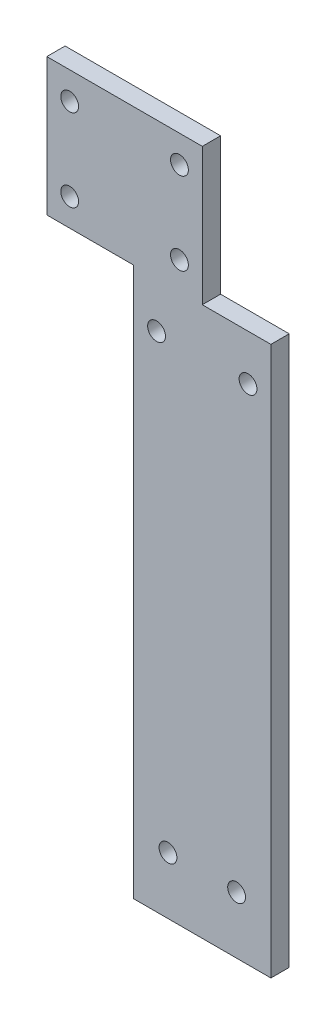
ISO-10303-21;
HEADER;
FILE_DESCRIPTION(('STEP AP214'),'2;1');
FILE_NAME('part.step','',(''),(''),'','','');
FILE_SCHEMA(('AUTOMOTIVE_DESIGN { 1 0 10303 214 1 1 1 1 }'));
ENDSEC;
DATA;
#1=APPLICATION_CONTEXT('core data for automotive mechanical design processes');
#2=APPLICATION_PROTOCOL_DEFINITION('international standard','automotive_design',2000,#1);
#3=PRODUCT_CONTEXT('',#1,'mechanical');
#4=PRODUCT('Part','Part','',(#3));
#5=PRODUCT_RELATED_PRODUCT_CATEGORY('part','',(#4));
#6=PRODUCT_DEFINITION_FORMATION('','',#4);
#7=PRODUCT_DEFINITION_CONTEXT('part definition',#1,'design');
#8=PRODUCT_DEFINITION('design','',#6,#7);
#9=PRODUCT_DEFINITION_SHAPE('','',#8);
#10=(LENGTH_UNIT() NAMED_UNIT(*) SI_UNIT(.MILLI.,.METRE.));
#11=(NAMED_UNIT(*) PLANE_ANGLE_UNIT() SI_UNIT($,.RADIAN.));
#12=(NAMED_UNIT(*) SI_UNIT($,.STERADIAN.) SOLID_ANGLE_UNIT());
#13=UNCERTAINTY_MEASURE_WITH_UNIT(LENGTH_MEASURE(1.E-05),#10,'distance_accuracy_value','');
#14=(GEOMETRIC_REPRESENTATION_CONTEXT(3) GLOBAL_UNCERTAINTY_ASSIGNED_CONTEXT((#13)) GLOBAL_UNIT_ASSIGNED_CONTEXT((#10,
#11,#12)) REPRESENTATION_CONTEXT('',''));
#15=CARTESIAN_POINT('',(0.,0.,0.));
#16=DIRECTION('',(0.,0.,1.));
#17=DIRECTION('',(1.,0.,0.));
#18=AXIS2_PLACEMENT_3D('',#15,#16,#17);
#19=CARTESIAN_POINT('',(0.,0.,4.));
#20=DIRECTION('',(0.,0.,1.));
#21=DIRECTION('',(1.,0.,0.));
#22=AXIS2_PLACEMENT_3D('',#19,#20,#21);
#23=PLANE('',#22);
#24=CARTESIAN_POINT('',(25.,110.,4.));
#25=DIRECTION('',(0.,0.,1.));
#26=DIRECTION('',(1.,0.,0.));
#27=AXIS2_PLACEMENT_3D('',#24,#25,#26);
#28=CIRCLE('',#27,1.94999999999999);
#29=CARTESIAN_POINT('',(26.95,110.,4.));
#30=VERTEX_POINT('',#29);
#31=EDGE_CURVE('E256',#30,#30,#28,.T.);
#32=ORIENTED_EDGE('',*,*,#31,.F.);
#33=EDGE_LOOP('',(#32));
#34=FACE_BOUND('',#33,.T.);
#35=CARTESIAN_POINT('',(-14.,126.,4.));
#36=DIRECTION('',(0.,0.,1.));
#37=DIRECTION('',(1.,0.,0.));
#38=AXIS2_PLACEMENT_3D('',#35,#36,#37);
#39=CIRCLE('',#38,1.95000000000001);
#40=CARTESIAN_POINT('',(-12.05,126.,4.));
#41=VERTEX_POINT('',#40);
#42=EDGE_CURVE('E240',#41,#41,#39,.T.);
#43=ORIENTED_EDGE('',*,*,#42,.F.);
#44=EDGE_LOOP('',(#43));
#45=FACE_BOUND('',#44,.T.);
#46=CARTESIAN_POINT('',(-14.,144.,4.));
#47=DIRECTION('',(0.,0.,1.));
#48=DIRECTION('',(1.,0.,0.));
#49=AXIS2_PLACEMENT_3D('',#46,#47,#48);
#50=CIRCLE('',#49,1.95000000000001);
#51=CARTESIAN_POINT('',(-12.05,144.,4.));
#52=VERTEX_POINT('',#51);
#53=EDGE_CURVE('E224',#52,#52,#50,.T.);
#54=ORIENTED_EDGE('',*,*,#53,.F.);
#55=EDGE_LOOP('',(#54));
#56=FACE_BOUND('',#55,.T.);
#57=CARTESIAN_POINT('',(7.50000000000001,12.5,4.));
#58=DIRECTION('',(0.,0.,1.));
#59=DIRECTION('',(1.,0.,0.));
#60=AXIS2_PLACEMENT_3D('',#57,#58,#59);
#61=CIRCLE('',#60,1.95);
#62=CARTESIAN_POINT('',(9.45000000000001,12.5,4.));
#63=VERTEX_POINT('',#62);
#64=EDGE_CURVE('E150',#63,#63,#61,.T.);
#65=ORIENTED_EDGE('',*,*,#64,.F.);
#66=EDGE_LOOP('',(#65));
#67=FACE_BOUND('',#66,.T.);
#68=DIRECTION('',(0.,-1.,0.));
#69=VECTOR('',#68,1.);
#70=CARTESIAN_POINT('',(0.,100.,4.));
#71=LINE('',#70,#69);
#72=CARTESIAN_POINT('',(0.,120.,4.));
#73=VERTEX_POINT('',#72);
#74=CARTESIAN_POINT('',(0.,0.,4.));
#75=VERTEX_POINT('',#74);
#76=EDGE_CURVE('E57',#73,#75,#71,.T.);
#77=ORIENTED_EDGE('',*,*,#76,.T.);
#78=DIRECTION('',(1.,0.,0.));
#79=VECTOR('',#78,1.);
#80=CARTESIAN_POINT('',(0.,0.,4.));
#81=LINE('',#80,#79);
#82=CARTESIAN_POINT('',(30.,0.,4.));
#83=VERTEX_POINT('',#82);
#84=EDGE_CURVE('E101',#75,#83,#81,.T.);
#85=ORIENTED_EDGE('',*,*,#84,.T.);
#86=DIRECTION('',(0.,1.,0.));
#87=VECTOR('',#86,1.);
#88=CARTESIAN_POINT('',(30.,0.,4.));
#89=LINE('',#88,#87);
#90=CARTESIAN_POINT('',(30.,120.,4.));
#91=VERTEX_POINT('',#90);
#92=EDGE_CURVE('E187',#83,#91,#89,.T.);
#93=ORIENTED_EDGE('',*,*,#92,.T.);
#94=DIRECTION('',(-1.,0.,0.));
#95=VECTOR('',#94,1.);
#96=CARTESIAN_POINT('',(15.,120.,4.));
#97=LINE('',#96,#95);
#98=CARTESIAN_POINT('',(15.,120.,4.));
#99=VERTEX_POINT('',#98);
#100=EDGE_CURVE('E202',#91,#99,#97,.T.);
#101=ORIENTED_EDGE('',*,*,#100,.T.);
#102=DIRECTION('',(0.,1.,0.));
#103=VECTOR('',#102,1.);
#104=CARTESIAN_POINT('',(15.,120.,4.));
#105=LINE('',#104,#103);
#106=CARTESIAN_POINT('',(15.,150.,4.));
#107=VERTEX_POINT('',#106);
#108=EDGE_CURVE('E121',#99,#107,#105,.T.);
#109=ORIENTED_EDGE('',*,*,#108,.T.);
#110=DIRECTION('',(-1.,0.,0.));
#111=VECTOR('',#110,1.);
#112=CARTESIAN_POINT('',(15.,150.,4.));
#113=LINE('',#112,#111);
#114=CARTESIAN_POINT('',(-19.,150.,4.));
#115=VERTEX_POINT('',#114);
#116=EDGE_CURVE('E115',#107,#115,#113,.T.);
#117=ORIENTED_EDGE('',*,*,#116,.T.);
#118=DIRECTION('',(0.,-1.,0.));
#119=VECTOR('',#118,1.);
#120=CARTESIAN_POINT('',(-19.,120.,4.));
#121=LINE('',#120,#119);
#122=CARTESIAN_POINT('',(-19.,120.,4.));
#123=VERTEX_POINT('',#122);
#124=EDGE_CURVE('E119',#115,#123,#121,.T.);
#125=ORIENTED_EDGE('',*,*,#124,.T.);
#126=DIRECTION('',(1.,0.,0.));
#127=VECTOR('',#126,1.);
#128=CARTESIAN_POINT('',(-19.,120.,4.));
#129=LINE('',#128,#127);
#130=EDGE_CURVE('E138',#123,#73,#129,.T.);
#131=ORIENTED_EDGE('',*,*,#130,.T.);
#132=EDGE_LOOP('',(#77,#85,#93,#101,#109,#117,#125,#131));
#133=FACE_BOUND('',#132,.T.);
#134=CARTESIAN_POINT('',(22.5,12.5,4.));
#135=DIRECTION('',(0.,0.,1.));
#136=DIRECTION('',(1.,0.,0.));
#137=AXIS2_PLACEMENT_3D('',#134,#135,#136);
#138=CIRCLE('',#137,1.95);
#139=CARTESIAN_POINT('',(24.45,12.5,4.));
#140=VERTEX_POINT('',#139);
#141=EDGE_CURVE('E216',#140,#140,#138,.T.);
#142=ORIENTED_EDGE('',*,*,#141,.F.);
#143=EDGE_LOOP('',(#142));
#144=FACE_BOUND('',#143,.T.);
#145=CARTESIAN_POINT('',(10.,144.,4.));
#146=DIRECTION('',(0.,0.,1.));
#147=DIRECTION('',(1.,0.,0.));
#148=AXIS2_PLACEMENT_3D('',#145,#146,#147);
#149=CIRCLE('',#148,1.95000000000001);
#150=CARTESIAN_POINT('',(11.95,144.,4.));
#151=VERTEX_POINT('',#150);
#152=EDGE_CURVE('E232',#151,#151,#149,.T.);
#153=ORIENTED_EDGE('',*,*,#152,.F.);
#154=EDGE_LOOP('',(#153));
#155=FACE_BOUND('',#154,.T.);
#156=CARTESIAN_POINT('',(10.,126.,4.));
#157=DIRECTION('',(0.,0.,1.));
#158=DIRECTION('',(1.,0.,0.));
#159=AXIS2_PLACEMENT_3D('',#156,#157,#158);
#160=CIRCLE('',#159,1.95000000000001);
#161=CARTESIAN_POINT('',(11.95,126.,4.));
#162=VERTEX_POINT('',#161);
#163=EDGE_CURVE('E248',#162,#162,#160,.T.);
#164=ORIENTED_EDGE('',*,*,#163,.F.);
#165=EDGE_LOOP('',(#164));
#166=FACE_BOUND('',#165,.T.);
#167=CARTESIAN_POINT('',(5.,110.,4.));
#168=DIRECTION('',(0.,0.,1.));
#169=DIRECTION('',(1.,0.,0.));
#170=AXIS2_PLACEMENT_3D('',#167,#168,#169);
#171=CIRCLE('',#170,1.94999999999998);
#172=CARTESIAN_POINT('',(6.94999999999998,110.,4.));
#173=VERTEX_POINT('',#172);
#174=EDGE_CURVE('E264',#173,#173,#171,.T.);
#175=ORIENTED_EDGE('',*,*,#174,.F.);
#176=EDGE_LOOP('',(#175));
#177=FACE_BOUND('',#176,.T.);
#178=ADVANCED_FACE('F39',(#34,#45,#56,#67,#133,#144,#155,#166,#177),#23,.T.);
#179=CARTESIAN_POINT('',(0.,0.,0.));
#180=DIRECTION('',(0.,0.,1.));
#181=DIRECTION('',(1.,0.,0.));
#182=AXIS2_PLACEMENT_3D('',#179,#180,#181);
#183=PLANE('',#182);
#184=DIRECTION('',(1.,0.,0.));
#185=VECTOR('',#184,1.);
#186=CARTESIAN_POINT('',(0.,0.,0.));
#187=LINE('',#186,#185);
#188=CARTESIAN_POINT('',(0.,0.,0.));
#189=VERTEX_POINT('',#188);
#190=CARTESIAN_POINT('',(30.,0.,0.));
#191=VERTEX_POINT('',#190);
#192=EDGE_CURVE('E145',#189,#191,#187,.T.);
#193=ORIENTED_EDGE('',*,*,#192,.F.);
#194=DIRECTION('',(0.,-1.,0.));
#195=VECTOR('',#194,1.);
#196=CARTESIAN_POINT('',(0.,120.,0.));
#197=LINE('',#196,#195);
#198=CARTESIAN_POINT('',(0.,120.,0.));
#199=VERTEX_POINT('',#198);
#200=EDGE_CURVE('E165',#199,#189,#197,.T.);
#201=ORIENTED_EDGE('',*,*,#200,.F.);
#202=DIRECTION('',(1.,0.,0.));
#203=VECTOR('',#202,1.);
#204=CARTESIAN_POINT('',(-19.,120.,0.));
#205=LINE('',#204,#203);
#206=CARTESIAN_POINT('',(-19.,120.,0.));
#207=VERTEX_POINT('',#206);
#208=EDGE_CURVE('E94',#207,#199,#205,.T.);
#209=ORIENTED_EDGE('',*,*,#208,.F.);
#210=DIRECTION('',(0.,-1.,0.));
#211=VECTOR('',#210,1.);
#212=CARTESIAN_POINT('',(-19.,120.,0.));
#213=LINE('',#212,#211);
#214=CARTESIAN_POINT('',(-19.,150.,0.));
#215=VERTEX_POINT('',#214);
#216=EDGE_CURVE('E87',#215,#207,#213,.T.);
#217=ORIENTED_EDGE('',*,*,#216,.F.);
#218=DIRECTION('',(-1.,0.,0.));
#219=VECTOR('',#218,1.);
#220=CARTESIAN_POINT('',(15.,150.,0.));
#221=LINE('',#220,#219);
#222=CARTESIAN_POINT('',(15.,150.,0.));
#223=VERTEX_POINT('',#222);
#224=EDGE_CURVE('E130',#223,#215,#221,.T.);
#225=ORIENTED_EDGE('',*,*,#224,.F.);
#226=DIRECTION('',(0.,1.,0.));
#227=VECTOR('',#226,1.);
#228=CARTESIAN_POINT('',(15.,120.,0.));
#229=LINE('',#228,#227);
#230=CARTESIAN_POINT('',(15.,120.,0.));
#231=VERTEX_POINT('',#230);
#232=EDGE_CURVE('E156',#231,#223,#229,.T.);
#233=ORIENTED_EDGE('',*,*,#232,.F.);
#234=DIRECTION('',(-1.,0.,0.));
#235=VECTOR('',#234,1.);
#236=CARTESIAN_POINT('',(15.,120.,0.));
#237=LINE('',#236,#235);
#238=CARTESIAN_POINT('',(30.,120.,0.));
#239=VERTEX_POINT('',#238);
#240=EDGE_CURVE('E153',#239,#231,#237,.T.);
#241=ORIENTED_EDGE('',*,*,#240,.F.);
#242=DIRECTION('',(0.,1.,0.));
#243=VECTOR('',#242,1.);
#244=CARTESIAN_POINT('',(30.,120.,0.));
#245=LINE('',#244,#243);
#246=EDGE_CURVE('E149',#191,#239,#245,.T.);
#247=ORIENTED_EDGE('',*,*,#246,.F.);
#248=EDGE_LOOP('',(#193,#201,#209,#217,#225,#233,#241,#247));
#249=FACE_BOUND('',#248,.T.);
#250=CARTESIAN_POINT('',(7.50000000000001,12.5,0.));
#251=DIRECTION('',(0.,0.,1.));
#252=DIRECTION('',(1.,0.,0.));
#253=AXIS2_PLACEMENT_3D('',#250,#251,#252);
#254=CIRCLE('',#253,1.95);
#255=CARTESIAN_POINT('',(9.45000000000001,12.5,0.));
#256=VERTEX_POINT('',#255);
#257=EDGE_CURVE('E212',#256,#256,#254,.T.);
#258=ORIENTED_EDGE('',*,*,#257,.T.);
#259=EDGE_LOOP('',(#258));
#260=FACE_BOUND('',#259,.T.);
#261=CARTESIAN_POINT('',(22.5,12.5,0.));
#262=DIRECTION('',(0.,0.,1.));
#263=DIRECTION('',(1.,0.,0.));
#264=AXIS2_PLACEMENT_3D('',#261,#262,#263);
#265=CIRCLE('',#264,1.95);
#266=CARTESIAN_POINT('',(24.45,12.5,0.));
#267=VERTEX_POINT('',#266);
#268=EDGE_CURVE('E220',#267,#267,#265,.T.);
#269=ORIENTED_EDGE('',*,*,#268,.T.);
#270=EDGE_LOOP('',(#269));
#271=FACE_BOUND('',#270,.T.);
#272=CARTESIAN_POINT('',(-14.,144.,0.));
#273=DIRECTION('',(0.,0.,1.));
#274=DIRECTION('',(1.,0.,0.));
#275=AXIS2_PLACEMENT_3D('',#272,#273,#274);
#276=CIRCLE('',#275,1.95000000000001);
#277=CARTESIAN_POINT('',(-12.05,144.,0.));
#278=VERTEX_POINT('',#277);
#279=EDGE_CURVE('E228',#278,#278,#276,.T.);
#280=ORIENTED_EDGE('',*,*,#279,.T.);
#281=EDGE_LOOP('',(#280));
#282=FACE_BOUND('',#281,.T.);
#283=CARTESIAN_POINT('',(10.,144.,0.));
#284=DIRECTION('',(0.,0.,1.));
#285=DIRECTION('',(1.,0.,0.));
#286=AXIS2_PLACEMENT_3D('',#283,#284,#285);
#287=CIRCLE('',#286,1.95000000000001);
#288=CARTESIAN_POINT('',(11.95,144.,0.));
#289=VERTEX_POINT('',#288);
#290=EDGE_CURVE('E236',#289,#289,#287,.T.);
#291=ORIENTED_EDGE('',*,*,#290,.T.);
#292=EDGE_LOOP('',(#291));
#293=FACE_BOUND('',#292,.T.);
#294=CARTESIAN_POINT('',(-14.,126.,0.));
#295=DIRECTION('',(0.,0.,1.));
#296=DIRECTION('',(1.,0.,0.));
#297=AXIS2_PLACEMENT_3D('',#294,#295,#296);
#298=CIRCLE('',#297,1.95000000000001);
#299=CARTESIAN_POINT('',(-12.05,126.,0.));
#300=VERTEX_POINT('',#299);
#301=EDGE_CURVE('E244',#300,#300,#298,.T.);
#302=ORIENTED_EDGE('',*,*,#301,.T.);
#303=EDGE_LOOP('',(#302));
#304=FACE_BOUND('',#303,.T.);
#305=CARTESIAN_POINT('',(10.,126.,0.));
#306=DIRECTION('',(0.,0.,1.));
#307=DIRECTION('',(1.,0.,0.));
#308=AXIS2_PLACEMENT_3D('',#305,#306,#307);
#309=CIRCLE('',#308,1.95000000000001);
#310=CARTESIAN_POINT('',(11.95,126.,0.));
#311=VERTEX_POINT('',#310);
#312=EDGE_CURVE('E252',#311,#311,#309,.T.);
#313=ORIENTED_EDGE('',*,*,#312,.T.);
#314=EDGE_LOOP('',(#313));
#315=FACE_BOUND('',#314,.T.);
#316=CARTESIAN_POINT('',(25.,110.,0.));
#317=DIRECTION('',(0.,0.,1.));
#318=DIRECTION('',(1.,0.,0.));
#319=AXIS2_PLACEMENT_3D('',#316,#317,#318);
#320=CIRCLE('',#319,1.94999999999999);
#321=CARTESIAN_POINT('',(26.95,110.,0.));
#322=VERTEX_POINT('',#321);
#323=EDGE_CURVE('E260',#322,#322,#320,.T.);
#324=ORIENTED_EDGE('',*,*,#323,.T.);
#325=EDGE_LOOP('',(#324));
#326=FACE_BOUND('',#325,.T.);
#327=CARTESIAN_POINT('',(5.,110.,0.));
#328=DIRECTION('',(0.,0.,1.));
#329=DIRECTION('',(1.,0.,0.));
#330=AXIS2_PLACEMENT_3D('',#327,#328,#329);
#331=CIRCLE('',#330,1.94999999999998);
#332=CARTESIAN_POINT('',(6.94999999999998,110.,0.));
#333=VERTEX_POINT('',#332);
#334=EDGE_CURVE('E268',#333,#333,#331,.T.);
#335=ORIENTED_EDGE('',*,*,#334,.T.);
#336=EDGE_LOOP('',(#335));
#337=FACE_BOUND('',#336,.T.);
#338=ADVANCED_FACE('F191',(#249,#260,#271,#282,#293,#304,#315,#326,#337),#183,.F.);
#339=CARTESIAN_POINT('',(0.,0.,4.));
#340=DIRECTION('',(0.,1.,0.));
#341=DIRECTION('',(0.,0.,1.));
#342=AXIS2_PLACEMENT_3D('',#339,#340,#341);
#343=PLANE('',#342);
#344=ORIENTED_EDGE('',*,*,#192,.T.);
#345=DIRECTION('',(0.,0.,-1.));
#346=VECTOR('',#345,1.);
#347=CARTESIAN_POINT('',(30.,0.,4.));
#348=LINE('',#347,#346);
#349=EDGE_CURVE('E49',#83,#191,#348,.T.);
#350=ORIENTED_EDGE('',*,*,#349,.F.);
#351=ORIENTED_EDGE('',*,*,#84,.F.);
#352=DIRECTION('',(0.,0.,-1.));
#353=VECTOR('',#352,1.);
#354=CARTESIAN_POINT('',(0.,0.,4.));
#355=LINE('',#354,#353);
#356=EDGE_CURVE('E11',#75,#189,#355,.T.);
#357=ORIENTED_EDGE('',*,*,#356,.T.);
#358=EDGE_LOOP('',(#344,#350,#351,#357));
#359=FACE_BOUND('',#358,.T.);
#360=ADVANCED_FACE('F41',(#359),#343,.F.);
#361=CARTESIAN_POINT('',(30.,120.,4.));
#362=DIRECTION('',(-1.,0.,0.));
#363=DIRECTION('',(0.,-1.,0.));
#364=AXIS2_PLACEMENT_3D('',#361,#362,#363);
#365=PLANE('',#364);
#366=ORIENTED_EDGE('',*,*,#246,.T.);
#367=DIRECTION('',(0.,0.,-1.));
#368=VECTOR('',#367,1.);
#369=CARTESIAN_POINT('',(30.,120.,4.));
#370=LINE('',#369,#368);
#371=EDGE_CURVE('E178',#91,#239,#370,.T.);
#372=ORIENTED_EDGE('',*,*,#371,.F.);
#373=ORIENTED_EDGE('',*,*,#92,.F.);
#374=ORIENTED_EDGE('',*,*,#349,.T.);
#375=EDGE_LOOP('',(#366,#372,#373,#374));
#376=FACE_BOUND('',#375,.T.);
#377=ADVANCED_FACE('F185',(#376),#365,.F.);
#378=CARTESIAN_POINT('',(15.,120.,4.));
#379=DIRECTION('',(0.,-1.,0.));
#380=DIRECTION('',(0.,0.,-1.));
#381=AXIS2_PLACEMENT_3D('',#378,#379,#380);
#382=PLANE('',#381);
#383=ORIENTED_EDGE('',*,*,#240,.T.);
#384=DIRECTION('',(0.,0.,-1.));
#385=VECTOR('',#384,1.);
#386=CARTESIAN_POINT('',(15.,120.,4.));
#387=LINE('',#386,#385);
#388=EDGE_CURVE('E174',#99,#231,#387,.T.);
#389=ORIENTED_EDGE('',*,*,#388,.F.);
#390=ORIENTED_EDGE('',*,*,#100,.F.);
#391=ORIENTED_EDGE('',*,*,#371,.T.);
#392=EDGE_LOOP('',(#383,#389,#390,#391));
#393=FACE_BOUND('',#392,.T.);
#394=ADVANCED_FACE('F197',(#393),#382,.F.);
#395=CARTESIAN_POINT('',(15.,120.,4.));
#396=DIRECTION('',(-1.,0.,0.));
#397=DIRECTION('',(0.,-1.,0.));
#398=AXIS2_PLACEMENT_3D('',#395,#396,#397);
#399=PLANE('',#398);
#400=ORIENTED_EDGE('',*,*,#232,.T.);
#401=DIRECTION('',(0.,0.,-1.));
#402=VECTOR('',#401,1.);
#403=CARTESIAN_POINT('',(15.,150.,4.));
#404=LINE('',#403,#402);
#405=EDGE_CURVE('E132',#107,#223,#404,.T.);
#406=ORIENTED_EDGE('',*,*,#405,.F.);
#407=ORIENTED_EDGE('',*,*,#108,.F.);
#408=ORIENTED_EDGE('',*,*,#388,.T.);
#409=EDGE_LOOP('',(#400,#406,#407,#408));
#410=FACE_BOUND('',#409,.T.);
#411=ADVANCED_FACE('F200',(#410),#399,.F.);
#412=CARTESIAN_POINT('',(15.,150.,4.));
#413=DIRECTION('',(0.,-1.,0.));
#414=DIRECTION('',(0.,0.,-1.));
#415=AXIS2_PLACEMENT_3D('',#412,#413,#414);
#416=PLANE('',#415);
#417=ORIENTED_EDGE('',*,*,#224,.T.);
#418=DIRECTION('',(0.,0.,-1.));
#419=VECTOR('',#418,1.);
#420=CARTESIAN_POINT('',(-19.,150.,4.));
#421=LINE('',#420,#419);
#422=EDGE_CURVE('E127',#115,#215,#421,.T.);
#423=ORIENTED_EDGE('',*,*,#422,.F.);
#424=ORIENTED_EDGE('',*,*,#116,.F.);
#425=ORIENTED_EDGE('',*,*,#405,.T.);
#426=EDGE_LOOP('',(#417,#423,#424,#425));
#427=FACE_BOUND('',#426,.T.);
#428=ADVANCED_FACE('F128',(#427),#416,.F.);
#429=CARTESIAN_POINT('',(-19.,120.,4.));
#430=DIRECTION('',(1.,0.,0.));
#431=DIRECTION('',(0.,0.,-1.));
#432=AXIS2_PLACEMENT_3D('',#429,#430,#431);
#433=PLANE('',#432);
#434=ORIENTED_EDGE('',*,*,#216,.T.);
#435=DIRECTION('',(0.,0.,-1.));
#436=VECTOR('',#435,1.);
#437=CARTESIAN_POINT('',(-19.,120.,4.));
#438=LINE('',#437,#436);
#439=EDGE_CURVE('E133',#123,#207,#438,.T.);
#440=ORIENTED_EDGE('',*,*,#439,.F.);
#441=ORIENTED_EDGE('',*,*,#124,.F.);
#442=ORIENTED_EDGE('',*,*,#422,.T.);
#443=EDGE_LOOP('',(#434,#440,#441,#442));
#444=FACE_BOUND('',#443,.T.);
#445=ADVANCED_FACE('F135',(#444),#433,.F.);
#446=CARTESIAN_POINT('',(-19.,120.,4.));
#447=DIRECTION('',(0.,1.,0.));
#448=DIRECTION('',(0.,0.,1.));
#449=AXIS2_PLACEMENT_3D('',#446,#447,#448);
#450=PLANE('',#449);
#451=ORIENTED_EDGE('',*,*,#208,.T.);
#452=DIRECTION('',(0.,0.,-1.));
#453=VECTOR('',#452,1.);
#454=CARTESIAN_POINT('',(0.,120.,4.));
#455=LINE('',#454,#453);
#456=EDGE_CURVE('E141',#73,#199,#455,.T.);
#457=ORIENTED_EDGE('',*,*,#456,.F.);
#458=ORIENTED_EDGE('',*,*,#130,.F.);
#459=ORIENTED_EDGE('',*,*,#439,.T.);
#460=EDGE_LOOP('',(#451,#457,#458,#459));
#461=FACE_BOUND('',#460,.T.);
#462=ADVANCED_FACE('F295',(#461),#450,.F.);
#463=CARTESIAN_POINT('',(0.,120.,4.));
#464=DIRECTION('',(1.,0.,0.));
#465=DIRECTION('',(0.,1.,0.));
#466=AXIS2_PLACEMENT_3D('',#463,#464,#465);
#467=PLANE('',#466);
#468=ORIENTED_EDGE('',*,*,#200,.T.);
#469=ORIENTED_EDGE('',*,*,#356,.F.);
#470=ORIENTED_EDGE('',*,*,#76,.F.);
#471=ORIENTED_EDGE('',*,*,#456,.T.);
#472=EDGE_LOOP('',(#468,#469,#470,#471));
#473=FACE_BOUND('',#472,.T.);
#474=ADVANCED_FACE('F292',(#473),#467,.F.);
#475=CARTESIAN_POINT('',(7.50000000000001,12.5,4.));
#476=DIRECTION('',(0.,0.,-1.));
#477=DIRECTION('',(-1.,0.,0.));
#478=AXIS2_PLACEMENT_3D('',#475,#476,#477);
#479=CYLINDRICAL_SURFACE('',#478,1.95);
#480=ORIENTED_EDGE('',*,*,#64,.T.);
#481=EDGE_LOOP('',(#480));
#482=FACE_BOUND('',#481,.T.);
#483=ORIENTED_EDGE('',*,*,#257,.F.);
#484=EDGE_LOOP('',(#483));
#485=FACE_BOUND('',#484,.T.);
#486=ADVANCED_FACE('F289',(#482,#485),#479,.F.);
#487=CARTESIAN_POINT('',(22.5,12.5,4.));
#488=DIRECTION('',(0.,0.,-1.));
#489=DIRECTION('',(-1.,0.,0.));
#490=AXIS2_PLACEMENT_3D('',#487,#488,#489);
#491=CYLINDRICAL_SURFACE('',#490,1.95);
#492=ORIENTED_EDGE('',*,*,#141,.T.);
#493=EDGE_LOOP('',(#492));
#494=FACE_BOUND('',#493,.T.);
#495=ORIENTED_EDGE('',*,*,#268,.F.);
#496=EDGE_LOOP('',(#495));
#497=FACE_BOUND('',#496,.T.);
#498=ADVANCED_FACE('F371',(#494,#497),#491,.F.);
#499=CARTESIAN_POINT('',(-14.,144.,4.));
#500=DIRECTION('',(0.,0.,-1.));
#501=DIRECTION('',(-1.,0.,0.));
#502=AXIS2_PLACEMENT_3D('',#499,#500,#501);
#503=CYLINDRICAL_SURFACE('',#502,1.95000000000001);
#504=ORIENTED_EDGE('',*,*,#53,.T.);
#505=EDGE_LOOP('',(#504));
#506=FACE_BOUND('',#505,.T.);
#507=ORIENTED_EDGE('',*,*,#279,.F.);
#508=EDGE_LOOP('',(#507));
#509=FACE_BOUND('',#508,.T.);
#510=ADVANCED_FACE('F379',(#506,#509),#503,.F.);
#511=CARTESIAN_POINT('',(10.,144.,4.));
#512=DIRECTION('',(0.,0.,-1.));
#513=DIRECTION('',(-1.,0.,0.));
#514=AXIS2_PLACEMENT_3D('',#511,#512,#513);
#515=CYLINDRICAL_SURFACE('',#514,1.95000000000001);
#516=ORIENTED_EDGE('',*,*,#152,.T.);
#517=EDGE_LOOP('',(#516));
#518=FACE_BOUND('',#517,.T.);
#519=ORIENTED_EDGE('',*,*,#290,.F.);
#520=EDGE_LOOP('',(#519));
#521=FACE_BOUND('',#520,.T.);
#522=ADVANCED_FACE('F387',(#518,#521),#515,.F.);
#523=CARTESIAN_POINT('',(-14.,126.,4.));
#524=DIRECTION('',(0.,0.,-1.));
#525=DIRECTION('',(-1.,0.,0.));
#526=AXIS2_PLACEMENT_3D('',#523,#524,#525);
#527=CYLINDRICAL_SURFACE('',#526,1.95000000000001);
#528=ORIENTED_EDGE('',*,*,#42,.T.);
#529=EDGE_LOOP('',(#528));
#530=FACE_BOUND('',#529,.T.);
#531=ORIENTED_EDGE('',*,*,#301,.F.);
#532=EDGE_LOOP('',(#531));
#533=FACE_BOUND('',#532,.T.);
#534=ADVANCED_FACE('F396',(#530,#533),#527,.F.);
#535=CARTESIAN_POINT('',(10.,126.,4.));
#536=DIRECTION('',(0.,0.,-1.));
#537=DIRECTION('',(-1.,0.,0.));
#538=AXIS2_PLACEMENT_3D('',#535,#536,#537);
#539=CYLINDRICAL_SURFACE('',#538,1.95000000000001);
#540=ORIENTED_EDGE('',*,*,#163,.T.);
#541=EDGE_LOOP('',(#540));
#542=FACE_BOUND('',#541,.T.);
#543=ORIENTED_EDGE('',*,*,#312,.F.);
#544=EDGE_LOOP('',(#543));
#545=FACE_BOUND('',#544,.T.);
#546=ADVANCED_FACE('F405',(#542,#545),#539,.F.);
#547=CARTESIAN_POINT('',(25.,110.,4.));
#548=DIRECTION('',(0.,0.,-1.));
#549=DIRECTION('',(-1.,0.,0.));
#550=AXIS2_PLACEMENT_3D('',#547,#548,#549);
#551=CYLINDRICAL_SURFACE('',#550,1.94999999999999);
#552=ORIENTED_EDGE('',*,*,#31,.T.);
#553=EDGE_LOOP('',(#552));
#554=FACE_BOUND('',#553,.T.);
#555=ORIENTED_EDGE('',*,*,#323,.F.);
#556=EDGE_LOOP('',(#555));
#557=FACE_BOUND('',#556,.T.);
#558=ADVANCED_FACE('F414',(#554,#557),#551,.F.);
#559=CARTESIAN_POINT('',(5.,110.,4.));
#560=DIRECTION('',(0.,0.,-1.));
#561=DIRECTION('',(-1.,0.,0.));
#562=AXIS2_PLACEMENT_3D('',#559,#560,#561);
#563=CYLINDRICAL_SURFACE('',#562,1.94999999999998);
#564=ORIENTED_EDGE('',*,*,#174,.T.);
#565=EDGE_LOOP('',(#564));
#566=FACE_BOUND('',#565,.T.);
#567=ORIENTED_EDGE('',*,*,#334,.F.);
#568=EDGE_LOOP('',(#567));
#569=FACE_BOUND('',#568,.T.);
#570=ADVANCED_FACE('F276',(#566,#569),#563,.F.);
#571=CLOSED_SHELL('',(#178,#338,#360,#377,#394,#411,#428,#445,#462,#474,#486,#498,#510,#522,
#534,#546,#558,#570));
#572=MANIFOLD_SOLID_BREP('B2',#571);
#573=ADVANCED_BREP_SHAPE_REPRESENTATION('',(#18,#572),#14);
#574=SHAPE_DEFINITION_REPRESENTATION(#9,#573);
ENDSEC;
END-ISO-10303-21;
